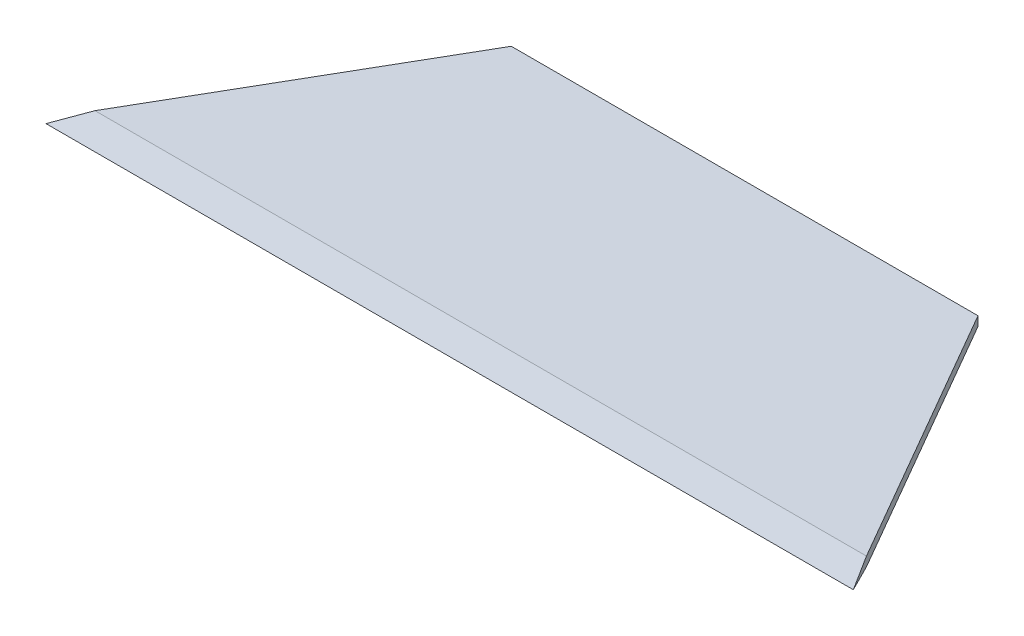
ISO-10303-21;
HEADER;
FILE_DESCRIPTION(('STEP AP214'),'2;1');
FILE_NAME('part.step','',(''),(''),'','','');
FILE_SCHEMA(('AUTOMOTIVE_DESIGN { 1 0 10303 214 1 1 1 1 }'));
ENDSEC;
DATA;
#1=APPLICATION_CONTEXT('core data for automotive mechanical design processes');
#2=APPLICATION_PROTOCOL_DEFINITION('international standard','automotive_design',2000,#1);
#3=PRODUCT_CONTEXT('',#1,'mechanical');
#4=PRODUCT('Part','Part','',(#3));
#5=PRODUCT_RELATED_PRODUCT_CATEGORY('part','',(#4));
#6=PRODUCT_DEFINITION_FORMATION('','',#4);
#7=PRODUCT_DEFINITION_CONTEXT('part definition',#1,'design');
#8=PRODUCT_DEFINITION('design','',#6,#7);
#9=PRODUCT_DEFINITION_SHAPE('','',#8);
#10=(LENGTH_UNIT() NAMED_UNIT(*) SI_UNIT(.MILLI.,.METRE.));
#11=(NAMED_UNIT(*) PLANE_ANGLE_UNIT() SI_UNIT($,.RADIAN.));
#12=(NAMED_UNIT(*) SI_UNIT($,.STERADIAN.) SOLID_ANGLE_UNIT());
#13=UNCERTAINTY_MEASURE_WITH_UNIT(LENGTH_MEASURE(1.E-05),#10,'distance_accuracy_value','');
#14=(GEOMETRIC_REPRESENTATION_CONTEXT(3) GLOBAL_UNCERTAINTY_ASSIGNED_CONTEXT((#13)) GLOBAL_UNIT_ASSIGNED_CONTEXT((#10,
#11,#12)) REPRESENTATION_CONTEXT('',''));
#15=CARTESIAN_POINT('',(0.,0.,0.));
#16=DIRECTION('',(0.,0.,1.));
#17=DIRECTION('',(1.,0.,0.));
#18=AXIS2_PLACEMENT_3D('',#15,#16,#17);
#19=CARTESIAN_POINT('',(-26.,0.6,9.50000000000001));
#20=DIRECTION('',(0.866025403784436,0.,0.500000000000004));
#21=DIRECTION('',(0.500000000000004,0.,-0.866025403784437));
#22=AXIS2_PLACEMENT_3D('',#19,#20,#21);
#23=PLANE('',#22);
#24=DIRECTION('',(-0.500000000000004,0.,0.866025403784436));
#25=VECTOR('',#24,1.);
#26=CARTESIAN_POINT('',(-26.,0.,9.50000000000001));
#27=LINE('',#26,#25);
#28=CARTESIAN_POINT('',(-15.030344885397,0.,-9.5));
#29=VERTEX_POINT('',#28);
#30=CARTESIAN_POINT('',(-24.8452994616207,0.,7.49999999999998));
#31=VERTEX_POINT('',#30);
#32=EDGE_CURVE('E112',#29,#31,#27,.T.);
#33=ORIENTED_EDGE('',*,*,#32,.T.);
#34=DIRECTION('',(-0.495833903628737,0.128821426980023,0.858809513200174));
#35=VECTOR('',#34,1.);
#36=CARTESIAN_POINT('',(-13.215734480639,-3.02144961254751,-12.6429974169839));
#37=LINE('',#36,#35);
#38=CARTESIAN_POINT('',(-26.,0.3,9.50000000000001));
#39=VERTEX_POINT('',#38);
#40=EDGE_CURVE('E11',#31,#39,#37,.T.);
#41=ORIENTED_EDGE('',*,*,#40,.T.);
#42=DIRECTION('',(-0.495833903628737,-0.128821426980023,0.858809513200174));
#43=VECTOR('',#42,1.);
#44=CARTESIAN_POINT('',(-18.7370512842092,2.18696942827744,-3.07979618851657));
#45=LINE('',#44,#43);
#46=CARTESIAN_POINT('',(-24.8452994616207,0.6,7.49999999999996));
#47=VERTEX_POINT('',#46);
#48=EDGE_CURVE('E123',#39,#47,#45,.F.);
#49=ORIENTED_EDGE('',*,*,#48,.T.);
#50=DIRECTION('',(-0.500000000000004,0.,0.866025403784436));
#51=VECTOR('',#50,1.);
#52=CARTESIAN_POINT('',(-26.,0.6,9.50000000000001));
#53=LINE('',#52,#51);
#54=CARTESIAN_POINT('',(-15.030344885397,0.6,-9.5));
#55=VERTEX_POINT('',#54);
#56=EDGE_CURVE('E95',#55,#47,#53,.T.);
#57=ORIENTED_EDGE('',*,*,#56,.F.);
#58=DIRECTION('',(0.,-1.,0.));
#59=VECTOR('',#58,1.);
#60=CARTESIAN_POINT('',(-15.030344885397,0.6,-9.5));
#61=LINE('',#60,#59);
#62=EDGE_CURVE('E103',#55,#29,#61,.T.);
#63=ORIENTED_EDGE('',*,*,#62,.T.);
#64=EDGE_LOOP('',(#33,#41,#49,#57,#63));
#65=FACE_BOUND('',#64,.T.);
#66=ADVANCED_FACE('F39',(#65),#23,.F.);
#67=CARTESIAN_POINT('',(15.030344885397,0.6,-9.50000000000001));
#68=DIRECTION('',(-0.866025403784436,0.,0.500000000000004));
#69=DIRECTION('',(0.500000000000004,0.,0.866025403784436));
#70=AXIS2_PLACEMENT_3D('',#67,#68,#69);
#71=PLANE('',#70);
#72=DIRECTION('',(-0.495833903628737,0.128821426980023,-0.858809513200173));
#73=VECTOR('',#72,1.);
#74=CARTESIAN_POINT('',(18.7370512842092,2.18696942827744,-3.07979618851658));
#75=LINE('',#74,#73);
#76=CARTESIAN_POINT('',(24.8452994616207,0.6,7.49999999999996));
#77=VERTEX_POINT('',#76);
#78=CARTESIAN_POINT('',(26.,0.3,9.50000000000001));
#79=VERTEX_POINT('',#78);
#80=EDGE_CURVE('E118',#77,#79,#75,.F.);
#81=ORIENTED_EDGE('',*,*,#80,.T.);
#82=DIRECTION('',(-0.495833903628737,-0.128821426980023,-0.858809513200173));
#83=VECTOR('',#82,1.);
#84=CARTESIAN_POINT('',(26.,0.299999999999998,9.50000000000001));
#85=LINE('',#84,#83);
#86=CARTESIAN_POINT('',(24.8452994616207,0.,7.49999999999997));
#87=VERTEX_POINT('',#86);
#88=EDGE_CURVE('E62',#79,#87,#85,.T.);
#89=ORIENTED_EDGE('',*,*,#88,.T.);
#90=DIRECTION('',(-0.500000000000004,0.,-0.866025403784436));
#91=VECTOR('',#90,1.);
#92=CARTESIAN_POINT('',(15.030344885397,0.,-9.50000000000001));
#93=LINE('',#92,#91);
#94=CARTESIAN_POINT('',(15.030344885397,0.,-9.50000000000001));
#95=VERTEX_POINT('',#94);
#96=EDGE_CURVE('E100',#87,#95,#93,.T.);
#97=ORIENTED_EDGE('',*,*,#96,.T.);
#98=DIRECTION('',(0.,-1.,0.));
#99=VECTOR('',#98,1.);
#100=CARTESIAN_POINT('',(15.030344885397,0.6,-9.50000000000001));
#101=LINE('',#100,#99);
#102=CARTESIAN_POINT('',(15.030344885397,0.6,-9.50000000000001));
#103=VERTEX_POINT('',#102);
#104=EDGE_CURVE('E98',#103,#95,#101,.T.);
#105=ORIENTED_EDGE('',*,*,#104,.F.);
#106=DIRECTION('',(-0.500000000000004,0.,-0.866025403784436));
#107=VECTOR('',#106,1.);
#108=CARTESIAN_POINT('',(15.030344885397,0.6,-9.50000000000001));
#109=LINE('',#108,#107);
#110=EDGE_CURVE('E86',#77,#103,#109,.T.);
#111=ORIENTED_EDGE('',*,*,#110,.F.);
#112=EDGE_LOOP('',(#81,#89,#97,#105,#111));
#113=FACE_BOUND('',#112,.T.);
#114=ADVANCED_FACE('F99',(#113),#71,.F.);
#115=CARTESIAN_POINT('',(-15.030344885397,0.6,-9.5));
#116=DIRECTION('',(0.,0.,1.));
#117=DIRECTION('',(1.,0.,0.));
#118=AXIS2_PLACEMENT_3D('',#115,#116,#117);
#119=PLANE('',#118);
#120=DIRECTION('',(-1.,0.,0.));
#121=VECTOR('',#120,1.);
#122=CARTESIAN_POINT('',(-15.030344885397,0.,-9.5));
#123=LINE('',#122,#121);
#124=EDGE_CURVE('E115',#95,#29,#123,.T.);
#125=ORIENTED_EDGE('',*,*,#124,.T.);
#126=ORIENTED_EDGE('',*,*,#62,.F.);
#127=DIRECTION('',(-1.,0.,0.));
#128=VECTOR('',#127,1.);
#129=CARTESIAN_POINT('',(-15.030344885397,0.6,-9.5));
#130=LINE('',#129,#128);
#131=EDGE_CURVE('E91',#103,#55,#130,.T.);
#132=ORIENTED_EDGE('',*,*,#131,.F.);
#133=ORIENTED_EDGE('',*,*,#104,.T.);
#134=EDGE_LOOP('',(#125,#126,#132,#133));
#135=FACE_BOUND('',#134,.T.);
#136=ADVANCED_FACE('F105',(#135),#119,.F.);
#137=CARTESIAN_POINT('',(0.,0.6,0.));
#138=DIRECTION('',(0.,-1.,0.));
#139=DIRECTION('',(0.,0.,-1.));
#140=AXIS2_PLACEMENT_3D('',#137,#138,#139);
#141=PLANE('',#140);
#142=ORIENTED_EDGE('',*,*,#56,.T.);
#143=DIRECTION('',(1.,0.,0.));
#144=VECTOR('',#143,1.);
#145=CARTESIAN_POINT('',(0.,0.6,7.49999999999996));
#146=LINE('',#145,#144);
#147=EDGE_CURVE('E94',#47,#77,#146,.T.);
#148=ORIENTED_EDGE('',*,*,#147,.T.);
#149=ORIENTED_EDGE('',*,*,#110,.T.);
#150=ORIENTED_EDGE('',*,*,#131,.T.);
#151=EDGE_LOOP('',(#142,#148,#149,#150));
#152=FACE_BOUND('',#151,.T.);
#153=ADVANCED_FACE('F89',(#152),#141,.F.);
#154=CARTESIAN_POINT('',(0.,0.,0.));
#155=DIRECTION('',(0.,-1.,0.));
#156=DIRECTION('',(0.,0.,-1.));
#157=AXIS2_PLACEMENT_3D('',#154,#155,#156);
#158=PLANE('',#157);
#159=ORIENTED_EDGE('',*,*,#96,.F.);
#160=DIRECTION('',(-1.,0.,0.));
#161=VECTOR('',#160,1.);
#162=CARTESIAN_POINT('',(-26.,0.,7.49999999999998));
#163=LINE('',#162,#161);
#164=EDGE_CURVE('E48',#87,#31,#163,.T.);
#165=ORIENTED_EDGE('',*,*,#164,.T.);
#166=ORIENTED_EDGE('',*,*,#32,.F.);
#167=ORIENTED_EDGE('',*,*,#124,.F.);
#168=EDGE_LOOP('',(#159,#165,#166,#167));
#169=FACE_BOUND('',#168,.T.);
#170=ADVANCED_FACE('F136',(#169),#158,.T.);
#171=CARTESIAN_POINT('',(0.,0.6,7.49999999999996));
#172=DIRECTION('',(0.,-0.988936352868298,-0.148340452930241));
#173=DIRECTION('',(1.,0.,0.));
#174=AXIS2_PLACEMENT_3D('',#171,#172,#173);
#175=PLANE('',#174);
#176=ORIENTED_EDGE('',*,*,#48,.F.);
#177=DIRECTION('',(-1.,0.,0.));
#178=VECTOR('',#177,1.);
#179=CARTESIAN_POINT('',(26.,0.3,9.50000000000001));
#180=LINE('',#179,#178);
#181=EDGE_CURVE('E120',#79,#39,#180,.T.);
#182=ORIENTED_EDGE('',*,*,#181,.F.);
#183=ORIENTED_EDGE('',*,*,#80,.F.);
#184=ORIENTED_EDGE('',*,*,#147,.F.);
#185=EDGE_LOOP('',(#176,#182,#183,#184));
#186=FACE_BOUND('',#185,.T.);
#187=ADVANCED_FACE('F130',(#186),#175,.F.);
#188=CARTESIAN_POINT('',(26.,0.299999999999998,9.50000000000001));
#189=DIRECTION('',(0.,-0.988936352868298,0.148340452930241));
#190=DIRECTION('',(-1.,0.,0.));
#191=AXIS2_PLACEMENT_3D('',#188,#189,#190);
#192=PLANE('',#191);
#193=ORIENTED_EDGE('',*,*,#40,.F.);
#194=ORIENTED_EDGE('',*,*,#164,.F.);
#195=ORIENTED_EDGE('',*,*,#88,.F.);
#196=ORIENTED_EDGE('',*,*,#181,.T.);
#197=EDGE_LOOP('',(#193,#194,#195,#196));
#198=FACE_BOUND('',#197,.T.);
#199=ADVANCED_FACE('F42',(#198),#192,.T.);
#200=CLOSED_SHELL('',(#66,#114,#136,#153,#170,#187,#199));
#201=MANIFOLD_SOLID_BREP('B2',#200);
#202=ADVANCED_BREP_SHAPE_REPRESENTATION('',(#18,#201),#14);
#203=SHAPE_DEFINITION_REPRESENTATION(#9,#202);
ENDSEC;
END-ISO-10303-21;
